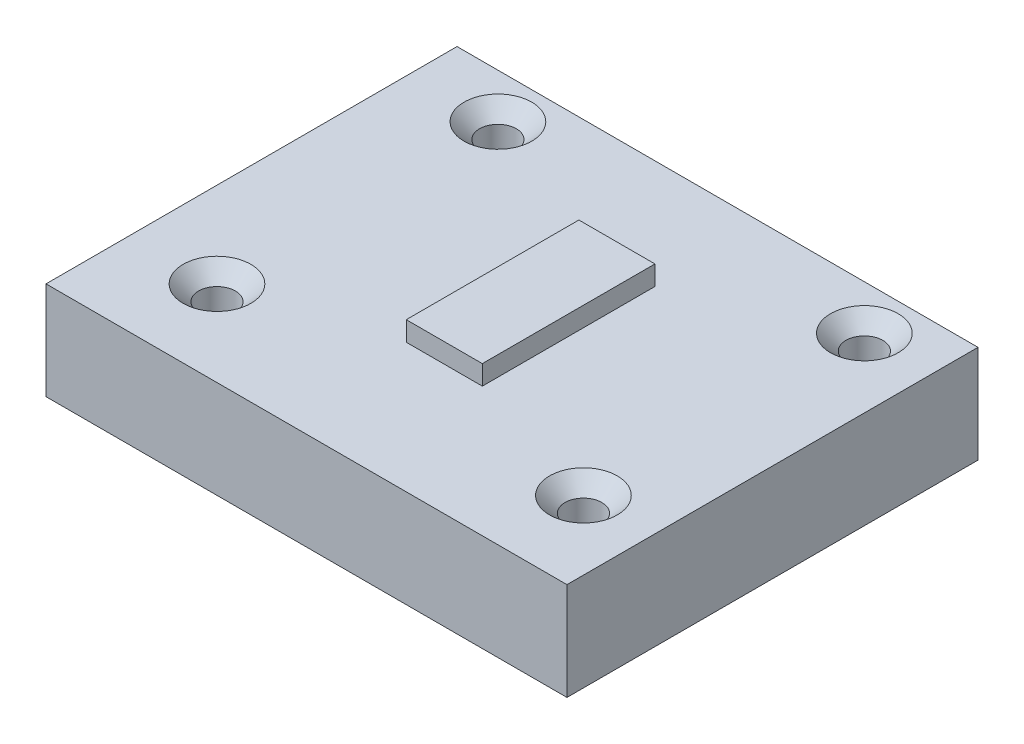
ISO-10303-21;
HEADER;
FILE_DESCRIPTION(('STEP AP214'),'2;1');
FILE_NAME('part.step','',(''),(''),'','','');
FILE_SCHEMA(('AUTOMOTIVE_DESIGN { 1 0 10303 214 1 1 1 1 }'));
ENDSEC;
DATA;
#1=APPLICATION_CONTEXT('core data for automotive mechanical design processes');
#2=APPLICATION_PROTOCOL_DEFINITION('international standard','automotive_design',2000,#1);
#3=PRODUCT_CONTEXT('',#1,'mechanical');
#4=PRODUCT('Part','Part','',(#3));
#5=PRODUCT_RELATED_PRODUCT_CATEGORY('part','',(#4));
#6=PRODUCT_DEFINITION_FORMATION('','',#4);
#7=PRODUCT_DEFINITION_CONTEXT('part definition',#1,'design');
#8=PRODUCT_DEFINITION('design','',#6,#7);
#9=PRODUCT_DEFINITION_SHAPE('','',#8);
#10=(LENGTH_UNIT() NAMED_UNIT(*) SI_UNIT(.MILLI.,.METRE.));
#11=(NAMED_UNIT(*) PLANE_ANGLE_UNIT() SI_UNIT($,.RADIAN.));
#12=(NAMED_UNIT(*) SI_UNIT($,.STERADIAN.) SOLID_ANGLE_UNIT());
#13=UNCERTAINTY_MEASURE_WITH_UNIT(LENGTH_MEASURE(1.E-05),#10,'distance_accuracy_value','');
#14=(GEOMETRIC_REPRESENTATION_CONTEXT(3) GLOBAL_UNCERTAINTY_ASSIGNED_CONTEXT((#13)) GLOBAL_UNIT_ASSIGNED_CONTEXT((#10,
#11,#12)) REPRESENTATION_CONTEXT('',''));
#15=CARTESIAN_POINT('',(0.,0.,0.));
#16=DIRECTION('',(0.,0.,1.));
#17=DIRECTION('',(1.,0.,0.));
#18=AXIS2_PLACEMENT_3D('',#15,#16,#17);
#19=CARTESIAN_POINT('',(0.,6.35,0.));
#20=DIRECTION('',(1.,0.,0.));
#21=DIRECTION('',(0.,0.,-1.));
#22=AXIS2_PLACEMENT_3D('',#19,#20,#21);
#23=PLANE('',#22);
#24=DIRECTION('',(0.,1.,0.));
#25=VECTOR('',#24,1.);
#26=CARTESIAN_POINT('',(0.,0.,-26.7116238034699));
#27=LINE('',#26,#25);
#28=CARTESIAN_POINT('',(0.,0.,-26.7116238034699));
#29=VERTEX_POINT('',#28);
#30=CARTESIAN_POINT('',(0.,6.35,-26.7116238034699));
#31=VERTEX_POINT('',#30);
#32=EDGE_CURVE('E113',#29,#31,#27,.T.);
#33=ORIENTED_EDGE('',*,*,#32,.F.);
#34=DIRECTION('',(0.,0.,1.));
#35=VECTOR('',#34,1.);
#36=CARTESIAN_POINT('',(0.,0.,0.));
#37=LINE('',#36,#35);
#38=CARTESIAN_POINT('',(0.,0.,0.));
#39=VERTEX_POINT('',#38);
#40=EDGE_CURVE('E126',#29,#39,#37,.T.);
#41=ORIENTED_EDGE('',*,*,#40,.T.);
#42=DIRECTION('',(0.,-1.,0.));
#43=VECTOR('',#42,1.);
#44=CARTESIAN_POINT('',(0.,6.35,0.));
#45=LINE('',#44,#43);
#46=CARTESIAN_POINT('',(0.,6.35,0.));
#47=VERTEX_POINT('',#46);
#48=EDGE_CURVE('E11',#47,#39,#45,.T.);
#49=ORIENTED_EDGE('',*,*,#48,.F.);
#50=DIRECTION('',(0.,0.,1.));
#51=VECTOR('',#50,1.);
#52=CARTESIAN_POINT('',(0.,6.35,0.));
#53=LINE('',#52,#51);
#54=EDGE_CURVE('E128',#31,#47,#53,.T.);
#55=ORIENTED_EDGE('',*,*,#54,.F.);
#56=EDGE_LOOP('',(#33,#41,#49,#55));
#57=FACE_BOUND('',#56,.T.);
#58=ADVANCED_FACE('F45',(#57),#23,.F.);
#59=CARTESIAN_POINT('',(0.,6.35,0.));
#60=DIRECTION('',(0.,-1.,0.));
#61=DIRECTION('',(0.,0.,-1.));
#62=AXIS2_PLACEMENT_3D('',#59,#60,#61);
#63=PLANE('',#62);
#64=DIRECTION('',(1.,0.,0.));
#65=VECTOR('',#64,1.);
#66=CARTESIAN_POINT('',(0.,6.35,0.));
#67=LINE('',#66,#65);
#68=CARTESIAN_POINT('',(33.855228979774,6.35,0.));
#69=VERTEX_POINT('',#68);
#70=EDGE_CURVE('E53',#47,#69,#67,.T.);
#71=ORIENTED_EDGE('',*,*,#70,.T.);
#72=DIRECTION('',(0.,0.,1.));
#73=VECTOR('',#72,1.);
#74=CARTESIAN_POINT('',(33.855228979774,6.35,0.));
#75=LINE('',#74,#73);
#76=CARTESIAN_POINT('',(33.855228979774,6.35,-26.7116238034699));
#77=VERTEX_POINT('',#76);
#78=EDGE_CURVE('E60',#77,#69,#75,.T.);
#79=ORIENTED_EDGE('',*,*,#78,.F.);
#80=DIRECTION('',(-1.,0.,0.));
#81=VECTOR('',#80,1.);
#82=CARTESIAN_POINT('',(0.,6.35,-26.7116238034699));
#83=LINE('',#82,#81);
#84=EDGE_CURVE('E241',#77,#31,#83,.T.);
#85=ORIENTED_EDGE('',*,*,#84,.T.);
#86=ORIENTED_EDGE('',*,*,#54,.T.);
#87=EDGE_LOOP('',(#71,#79,#85,#86));
#88=FACE_BOUND('',#87,.T.);
#89=CARTESIAN_POINT('',(29.36875,6.35,-23.8125));
#90=DIRECTION('',(0.,1.,0.));
#91=DIRECTION('',(0.,0.,1.));
#92=AXIS2_PLACEMENT_3D('',#89,#90,#91);
#93=CIRCLE('',#92,2.2);
#94=CARTESIAN_POINT('',(29.36875,6.35,-21.6125));
#95=VERTEX_POINT('',#94);
#96=EDGE_CURVE('E152',#95,#95,#93,.T.);
#97=ORIENTED_EDGE('',*,*,#96,.F.);
#98=EDGE_LOOP('',(#97));
#99=FACE_BOUND('',#98,.T.);
#100=CARTESIAN_POINT('',(5.55625,6.35,-23.8125));
#101=DIRECTION('',(0.,1.,0.));
#102=DIRECTION('',(0.,0.,1.));
#103=AXIS2_PLACEMENT_3D('',#100,#101,#102);
#104=CIRCLE('',#103,2.2);
#105=CARTESIAN_POINT('',(5.55625,6.35,-21.6125));
#106=VERTEX_POINT('',#105);
#107=EDGE_CURVE('E164',#106,#106,#104,.T.);
#108=ORIENTED_EDGE('',*,*,#107,.F.);
#109=EDGE_LOOP('',(#108));
#110=FACE_BOUND('',#109,.T.);
#111=CARTESIAN_POINT('',(29.36875,6.35,-5.55625));
#112=DIRECTION('',(0.,1.,0.));
#113=DIRECTION('',(0.,0.,1.));
#114=AXIS2_PLACEMENT_3D('',#111,#112,#113);
#115=CIRCLE('',#114,2.2);
#116=CARTESIAN_POINT('',(29.36875,6.35,-3.35625));
#117=VERTEX_POINT('',#116);
#118=EDGE_CURVE('E176',#117,#117,#115,.T.);
#119=ORIENTED_EDGE('',*,*,#118,.F.);
#120=EDGE_LOOP('',(#119));
#121=FACE_BOUND('',#120,.T.);
#122=CARTESIAN_POINT('',(5.55625,6.35,-5.55625));
#123=DIRECTION('',(0.,1.,0.));
#124=DIRECTION('',(0.,0.,1.));
#125=AXIS2_PLACEMENT_3D('',#122,#123,#124);
#126=CIRCLE('',#125,2.2);
#127=CARTESIAN_POINT('',(5.55625,6.35,-3.35625));
#128=VERTEX_POINT('',#127);
#129=EDGE_CURVE('E188',#128,#128,#126,.T.);
#130=ORIENTED_EDGE('',*,*,#129,.F.);
#131=EDGE_LOOP('',(#130));
#132=FACE_BOUND('',#131,.T.);
#133=DIRECTION('',(0.,0.,1.));
#134=VECTOR('',#133,1.);
#135=CARTESIAN_POINT('',(14.9914350712743,6.35,-19.6382153627277));
#136=LINE('',#135,#134);
#137=CARTESIAN_POINT('',(14.9914350712743,6.35,-19.6382153627277));
#138=VERTEX_POINT('',#137);
#139=CARTESIAN_POINT('',(14.9914350712743,6.35,-8.41998192519793));
#140=VERTEX_POINT('',#139);
#141=EDGE_CURVE('E219',#138,#140,#136,.T.);
#142=ORIENTED_EDGE('',*,*,#141,.F.);
#143=DIRECTION('',(-1.,0.,0.));
#144=VECTOR('',#143,1.);
#145=CARTESIAN_POINT('',(14.9914350712743,6.35,-19.6382153627277));
#146=LINE('',#145,#144);
#147=CARTESIAN_POINT('',(19.935063365779,6.35,-19.6382153627277));
#148=VERTEX_POINT('',#147);
#149=EDGE_CURVE('E208',#148,#138,#146,.T.);
#150=ORIENTED_EDGE('',*,*,#149,.F.);
#151=DIRECTION('',(0.,0.,-1.));
#152=VECTOR('',#151,1.);
#153=CARTESIAN_POINT('',(19.935063365779,6.35,-19.6382153627277));
#154=LINE('',#153,#152);
#155=CARTESIAN_POINT('',(19.935063365779,6.35,-8.41998192519793));
#156=VERTEX_POINT('',#155);
#157=EDGE_CURVE('E213',#156,#148,#154,.T.);
#158=ORIENTED_EDGE('',*,*,#157,.F.);
#159=DIRECTION('',(1.,0.,0.));
#160=VECTOR('',#159,1.);
#161=CARTESIAN_POINT('',(14.9914350712743,6.35,-8.41998192519793));
#162=LINE('',#161,#160);
#163=EDGE_CURVE('E68',#140,#156,#162,.T.);
#164=ORIENTED_EDGE('',*,*,#163,.F.);
#165=EDGE_LOOP('',(#142,#150,#158,#164));
#166=FACE_BOUND('',#165,.T.);
#167=ADVANCED_FACE('F249',(#88,#99,#110,#121,#132,#166),#63,.F.);
#168=CARTESIAN_POINT('',(0.,0.,0.));
#169=DIRECTION('',(0.,-1.,0.));
#170=DIRECTION('',(0.,0.,-1.));
#171=AXIS2_PLACEMENT_3D('',#168,#169,#170);
#172=PLANE('',#171);
#173=DIRECTION('',(0.,0.,1.));
#174=VECTOR('',#173,1.);
#175=CARTESIAN_POINT('',(33.855228979774,0.,0.));
#176=LINE('',#175,#174);
#177=CARTESIAN_POINT('',(33.855228979774,0.,-26.7116238034699));
#178=VERTEX_POINT('',#177);
#179=CARTESIAN_POINT('',(33.855228979774,0.,0.));
#180=VERTEX_POINT('',#179);
#181=EDGE_CURVE('E121',#178,#180,#176,.T.);
#182=ORIENTED_EDGE('',*,*,#181,.T.);
#183=DIRECTION('',(1.,0.,0.));
#184=VECTOR('',#183,1.);
#185=CARTESIAN_POINT('',(0.,0.,0.));
#186=LINE('',#185,#184);
#187=EDGE_CURVE('E134',#39,#180,#186,.T.);
#188=ORIENTED_EDGE('',*,*,#187,.F.);
#189=ORIENTED_EDGE('',*,*,#40,.F.);
#190=DIRECTION('',(-1.,0.,0.));
#191=VECTOR('',#190,1.);
#192=CARTESIAN_POINT('',(0.,0.,-26.7116238034699));
#193=LINE('',#192,#191);
#194=EDGE_CURVE('E109',#178,#29,#193,.T.);
#195=ORIENTED_EDGE('',*,*,#194,.F.);
#196=EDGE_LOOP('',(#182,#188,#189,#195));
#197=FACE_BOUND('',#196,.T.);
#198=CARTESIAN_POINT('',(29.36875,0.,-23.8125));
#199=DIRECTION('',(0.,1.,0.));
#200=DIRECTION('',(0.,0.,1.));
#201=AXIS2_PLACEMENT_3D('',#198,#199,#200);
#202=CIRCLE('',#201,1.2);
#203=CARTESIAN_POINT('',(29.36875,0.,-22.6125));
#204=VERTEX_POINT('',#203);
#205=EDGE_CURVE('E136',#204,#204,#202,.T.);
#206=ORIENTED_EDGE('',*,*,#205,.T.);
#207=EDGE_LOOP('',(#206));
#208=FACE_BOUND('',#207,.T.);
#209=CARTESIAN_POINT('',(5.55625,0.,-23.8125));
#210=DIRECTION('',(0.,1.,0.));
#211=DIRECTION('',(0.,0.,1.));
#212=AXIS2_PLACEMENT_3D('',#209,#210,#211);
#213=CIRCLE('',#212,1.2);
#214=CARTESIAN_POINT('',(5.55625,0.,-22.6125));
#215=VERTEX_POINT('',#214);
#216=EDGE_CURVE('E156',#215,#215,#213,.T.);
#217=ORIENTED_EDGE('',*,*,#216,.T.);
#218=EDGE_LOOP('',(#217));
#219=FACE_BOUND('',#218,.T.);
#220=CARTESIAN_POINT('',(29.36875,0.,-5.55625));
#221=DIRECTION('',(0.,1.,0.));
#222=DIRECTION('',(0.,0.,1.));
#223=AXIS2_PLACEMENT_3D('',#220,#221,#222);
#224=CIRCLE('',#223,1.2);
#225=CARTESIAN_POINT('',(29.36875,0.,-4.35625));
#226=VERTEX_POINT('',#225);
#227=EDGE_CURVE('E168',#226,#226,#224,.T.);
#228=ORIENTED_EDGE('',*,*,#227,.T.);
#229=EDGE_LOOP('',(#228));
#230=FACE_BOUND('',#229,.T.);
#231=CARTESIAN_POINT('',(5.55625,0.,-5.55625));
#232=DIRECTION('',(0.,1.,0.));
#233=DIRECTION('',(0.,0.,1.));
#234=AXIS2_PLACEMENT_3D('',#231,#232,#233);
#235=CIRCLE('',#234,1.2);
#236=CARTESIAN_POINT('',(5.55625,0.,-4.35625));
#237=VERTEX_POINT('',#236);
#238=EDGE_CURVE('E180',#237,#237,#235,.T.);
#239=ORIENTED_EDGE('',*,*,#238,.T.);
#240=EDGE_LOOP('',(#239));
#241=FACE_BOUND('',#240,.T.);
#242=ADVANCED_FACE('F131',(#197,#208,#219,#230,#241),#172,.T.);
#243=CARTESIAN_POINT('',(0.,6.35,0.));
#244=DIRECTION('',(0.,0.,-1.));
#245=DIRECTION('',(-1.,0.,0.));
#246=AXIS2_PLACEMENT_3D('',#243,#244,#245);
#247=PLANE('',#246);
#248=ORIENTED_EDGE('',*,*,#187,.T.);
#249=DIRECTION('',(0.,1.,0.));
#250=VECTOR('',#249,1.);
#251=CARTESIAN_POINT('',(33.855228979774,0.,0.));
#252=LINE('',#251,#250);
#253=EDGE_CURVE('E223',#180,#69,#252,.T.);
#254=ORIENTED_EDGE('',*,*,#253,.T.);
#255=ORIENTED_EDGE('',*,*,#70,.F.);
#256=ORIENTED_EDGE('',*,*,#48,.T.);
#257=EDGE_LOOP('',(#248,#254,#255,#256));
#258=FACE_BOUND('',#257,.T.);
#259=ADVANCED_FACE('F246',(#258),#247,.F.);
#260=CARTESIAN_POINT('',(29.36875,6.35,-23.8125));
#261=DIRECTION('',(0.,1.,0.));
#262=DIRECTION('',(0.,0.,1.));
#263=AXIS2_PLACEMENT_3D('',#260,#261,#262);
#264=CYLINDRICAL_SURFACE('',#263,1.2);
#265=ORIENTED_EDGE('',*,*,#205,.F.);
#266=EDGE_LOOP('',(#265));
#267=FACE_BOUND('',#266,.T.);
#268=CARTESIAN_POINT('',(29.36875,5.35,-23.8125));
#269=DIRECTION('',(0.,1.,0.));
#270=DIRECTION('',(0.,0.,1.));
#271=AXIS2_PLACEMENT_3D('',#268,#269,#270);
#272=CIRCLE('',#271,1.2);
#273=CARTESIAN_POINT('',(29.36875,5.35,-22.6125));
#274=VERTEX_POINT('',#273);
#275=EDGE_CURVE('E141',#274,#274,#272,.T.);
#276=ORIENTED_EDGE('',*,*,#275,.T.);
#277=EDGE_LOOP('',(#276));
#278=FACE_BOUND('',#277,.T.);
#279=ADVANCED_FACE('F315',(#267,#278),#264,.F.);
#280=CARTESIAN_POINT('',(29.36875,6.35,-23.8125));
#281=DIRECTION('',(0.,1.,0.));
#282=DIRECTION('',(0.,0.,1.));
#283=AXIS2_PLACEMENT_3D('',#280,#281,#282);
#284=CONICAL_SURFACE('',#283,2.2,0.785398163397448);
#285=ORIENTED_EDGE('',*,*,#275,.F.);
#286=EDGE_LOOP('',(#285));
#287=FACE_BOUND('',#286,.T.);
#288=ORIENTED_EDGE('',*,*,#96,.T.);
#289=EDGE_LOOP('',(#288));
#290=FACE_BOUND('',#289,.T.);
#291=ADVANCED_FACE('F421',(#287,#290),#284,.F.);
#292=CARTESIAN_POINT('',(5.55625,6.35,-23.8125));
#293=DIRECTION('',(0.,1.,0.));
#294=DIRECTION('',(0.,0.,1.));
#295=AXIS2_PLACEMENT_3D('',#292,#293,#294);
#296=CYLINDRICAL_SURFACE('',#295,1.2);
#297=ORIENTED_EDGE('',*,*,#216,.F.);
#298=EDGE_LOOP('',(#297));
#299=FACE_BOUND('',#298,.T.);
#300=CARTESIAN_POINT('',(5.55625,5.35,-23.8125));
#301=DIRECTION('',(0.,1.,0.));
#302=DIRECTION('',(0.,0.,1.));
#303=AXIS2_PLACEMENT_3D('',#300,#301,#302);
#304=CIRCLE('',#303,1.2);
#305=CARTESIAN_POINT('',(5.55625,5.35,-22.6125));
#306=VERTEX_POINT('',#305);
#307=EDGE_CURVE('E160',#306,#306,#304,.T.);
#308=ORIENTED_EDGE('',*,*,#307,.T.);
#309=EDGE_LOOP('',(#308));
#310=FACE_BOUND('',#309,.T.);
#311=ADVANCED_FACE('F411',(#299,#310),#296,.F.);
#312=CARTESIAN_POINT('',(5.55625,6.35,-23.8125));
#313=DIRECTION('',(0.,1.,0.));
#314=DIRECTION('',(0.,0.,1.));
#315=AXIS2_PLACEMENT_3D('',#312,#313,#314);
#316=CONICAL_SURFACE('',#315,2.2,0.785398163397449);
#317=ORIENTED_EDGE('',*,*,#307,.F.);
#318=EDGE_LOOP('',(#317));
#319=FACE_BOUND('',#318,.T.);
#320=ORIENTED_EDGE('',*,*,#107,.T.);
#321=EDGE_LOOP('',(#320));
#322=FACE_BOUND('',#321,.T.);
#323=ADVANCED_FACE('F401',(#319,#322),#316,.F.);
#324=CARTESIAN_POINT('',(29.36875,6.35,-5.55625));
#325=DIRECTION('',(0.,1.,0.));
#326=DIRECTION('',(0.,0.,1.));
#327=AXIS2_PLACEMENT_3D('',#324,#325,#326);
#328=CYLINDRICAL_SURFACE('',#327,1.2);
#329=ORIENTED_EDGE('',*,*,#227,.F.);
#330=EDGE_LOOP('',(#329));
#331=FACE_BOUND('',#330,.T.);
#332=CARTESIAN_POINT('',(29.36875,5.35,-5.55625));
#333=DIRECTION('',(0.,1.,0.));
#334=DIRECTION('',(0.,0.,1.));
#335=AXIS2_PLACEMENT_3D('',#332,#333,#334);
#336=CIRCLE('',#335,1.2);
#337=CARTESIAN_POINT('',(29.36875,5.35,-4.35625));
#338=VERTEX_POINT('',#337);
#339=EDGE_CURVE('E172',#338,#338,#336,.T.);
#340=ORIENTED_EDGE('',*,*,#339,.T.);
#341=EDGE_LOOP('',(#340));
#342=FACE_BOUND('',#341,.T.);
#343=ADVANCED_FACE('F391',(#331,#342),#328,.F.);
#344=CARTESIAN_POINT('',(29.36875,6.35,-5.55625));
#345=DIRECTION('',(0.,1.,0.));
#346=DIRECTION('',(0.,0.,1.));
#347=AXIS2_PLACEMENT_3D('',#344,#345,#346);
#348=CONICAL_SURFACE('',#347,2.2,0.785398163397448);
#349=ORIENTED_EDGE('',*,*,#339,.F.);
#350=EDGE_LOOP('',(#349));
#351=FACE_BOUND('',#350,.T.);
#352=ORIENTED_EDGE('',*,*,#118,.T.);
#353=EDGE_LOOP('',(#352));
#354=FACE_BOUND('',#353,.T.);
#355=ADVANCED_FACE('F381',(#351,#354),#348,.F.);
#356=CARTESIAN_POINT('',(5.55625,6.35,-5.55625));
#357=DIRECTION('',(0.,1.,0.));
#358=DIRECTION('',(0.,0.,1.));
#359=AXIS2_PLACEMENT_3D('',#356,#357,#358);
#360=CYLINDRICAL_SURFACE('',#359,1.2);
#361=ORIENTED_EDGE('',*,*,#238,.F.);
#362=EDGE_LOOP('',(#361));
#363=FACE_BOUND('',#362,.T.);
#364=CARTESIAN_POINT('',(5.55625,5.35,-5.55625));
#365=DIRECTION('',(0.,1.,0.));
#366=DIRECTION('',(0.,0.,1.));
#367=AXIS2_PLACEMENT_3D('',#364,#365,#366);
#368=CIRCLE('',#367,1.2);
#369=CARTESIAN_POINT('',(5.55625,5.35,-4.35625));
#370=VERTEX_POINT('',#369);
#371=EDGE_CURVE('E184',#370,#370,#368,.T.);
#372=ORIENTED_EDGE('',*,*,#371,.T.);
#373=EDGE_LOOP('',(#372));
#374=FACE_BOUND('',#373,.T.);
#375=ADVANCED_FACE('F371',(#363,#374),#360,.F.);
#376=CARTESIAN_POINT('',(5.55625,6.35,-5.55625));
#377=DIRECTION('',(0.,1.,0.));
#378=DIRECTION('',(0.,0.,1.));
#379=AXIS2_PLACEMENT_3D('',#376,#377,#378);
#380=CONICAL_SURFACE('',#379,2.2,0.785398163397449);
#381=ORIENTED_EDGE('',*,*,#371,.F.);
#382=EDGE_LOOP('',(#381));
#383=FACE_BOUND('',#382,.T.);
#384=ORIENTED_EDGE('',*,*,#129,.T.);
#385=EDGE_LOOP('',(#384));
#386=FACE_BOUND('',#385,.T.);
#387=ADVANCED_FACE('F284',(#383,#386),#380,.F.);
#388=CARTESIAN_POINT('',(14.9914350712743,7.62,-19.6382153627277));
#389=DIRECTION('',(1.,0.,0.));
#390=DIRECTION('',(0.,0.,-1.));
#391=AXIS2_PLACEMENT_3D('',#388,#389,#390);
#392=PLANE('',#391);
#393=ORIENTED_EDGE('',*,*,#141,.T.);
#394=DIRECTION('',(0.,-1.,0.));
#395=VECTOR('',#394,1.);
#396=CARTESIAN_POINT('',(14.9914350712743,7.62,-8.41998192519793));
#397=LINE('',#396,#395);
#398=CARTESIAN_POINT('',(14.9914350712743,7.62,-8.41998192519793));
#399=VERTEX_POINT('',#398);
#400=EDGE_CURVE('E192',#399,#140,#397,.T.);
#401=ORIENTED_EDGE('',*,*,#400,.F.);
#402=DIRECTION('',(0.,0.,1.));
#403=VECTOR('',#402,1.);
#404=CARTESIAN_POINT('',(14.9914350712743,7.62,-19.6382153627277));
#405=LINE('',#404,#403);
#406=CARTESIAN_POINT('',(14.9914350712743,7.62,-19.6382153627277));
#407=VERTEX_POINT('',#406);
#408=EDGE_CURVE('E212',#407,#399,#405,.T.);
#409=ORIENTED_EDGE('',*,*,#408,.F.);
#410=DIRECTION('',(0.,-1.,0.));
#411=VECTOR('',#410,1.);
#412=CARTESIAN_POINT('',(14.9914350712743,7.62,-19.6382153627277));
#413=LINE('',#412,#411);
#414=EDGE_CURVE('E203',#407,#138,#413,.T.);
#415=ORIENTED_EDGE('',*,*,#414,.T.);
#416=EDGE_LOOP('',(#393,#401,#409,#415));
#417=FACE_BOUND('',#416,.T.);
#418=ADVANCED_FACE('F268',(#417),#392,.F.);
#419=CARTESIAN_POINT('',(14.9914350712743,7.62,-8.41998192519793));
#420=DIRECTION('',(0.,0.,-1.));
#421=DIRECTION('',(-1.,0.,0.));
#422=AXIS2_PLACEMENT_3D('',#419,#420,#421);
#423=PLANE('',#422);
#424=ORIENTED_EDGE('',*,*,#163,.T.);
#425=DIRECTION('',(0.,-1.,0.));
#426=VECTOR('',#425,1.);
#427=CARTESIAN_POINT('',(19.935063365779,7.62,-8.41998192519793));
#428=LINE('',#427,#426);
#429=CARTESIAN_POINT('',(19.935063365779,7.62,-8.41998192519793));
#430=VERTEX_POINT('',#429);
#431=EDGE_CURVE('E195',#430,#156,#428,.T.);
#432=ORIENTED_EDGE('',*,*,#431,.F.);
#433=DIRECTION('',(1.,0.,0.));
#434=VECTOR('',#433,1.);
#435=CARTESIAN_POINT('',(14.9914350712743,7.62,-8.41998192519793));
#436=LINE('',#435,#434);
#437=EDGE_CURVE('E229',#399,#430,#436,.T.);
#438=ORIENTED_EDGE('',*,*,#437,.F.);
#439=ORIENTED_EDGE('',*,*,#400,.T.);
#440=EDGE_LOOP('',(#424,#432,#438,#439));
#441=FACE_BOUND('',#440,.T.);
#442=ADVANCED_FACE('F276',(#441),#423,.F.);
#443=CARTESIAN_POINT('',(19.935063365779,7.62,-19.6382153627277));
#444=DIRECTION('',(-1.,0.,0.));
#445=DIRECTION('',(0.,0.,1.));
#446=AXIS2_PLACEMENT_3D('',#443,#444,#445);
#447=PLANE('',#446);
#448=ORIENTED_EDGE('',*,*,#157,.T.);
#449=DIRECTION('',(0.,-1.,0.));
#450=VECTOR('',#449,1.);
#451=CARTESIAN_POINT('',(19.935063365779,7.62,-19.6382153627277));
#452=LINE('',#451,#450);
#453=CARTESIAN_POINT('',(19.935063365779,7.62,-19.6382153627277));
#454=VERTEX_POINT('',#453);
#455=EDGE_CURVE('E199',#454,#148,#452,.T.);
#456=ORIENTED_EDGE('',*,*,#455,.F.);
#457=DIRECTION('',(0.,0.,-1.));
#458=VECTOR('',#457,1.);
#459=CARTESIAN_POINT('',(19.935063365779,7.62,-19.6382153627277));
#460=LINE('',#459,#458);
#461=EDGE_CURVE('E226',#430,#454,#460,.T.);
#462=ORIENTED_EDGE('',*,*,#461,.F.);
#463=ORIENTED_EDGE('',*,*,#431,.T.);
#464=EDGE_LOOP('',(#448,#456,#462,#463));
#465=FACE_BOUND('',#464,.T.);
#466=ADVANCED_FACE('F274',(#465),#447,.F.);
#467=CARTESIAN_POINT('',(14.9914350712743,7.62,-19.6382153627277));
#468=DIRECTION('',(0.,0.,1.));
#469=DIRECTION('',(1.,0.,0.));
#470=AXIS2_PLACEMENT_3D('',#467,#468,#469);
#471=PLANE('',#470);
#472=ORIENTED_EDGE('',*,*,#149,.T.);
#473=ORIENTED_EDGE('',*,*,#414,.F.);
#474=DIRECTION('',(-1.,0.,0.));
#475=VECTOR('',#474,1.);
#476=CARTESIAN_POINT('',(14.9914350712743,7.62,-19.6382153627277));
#477=LINE('',#476,#475);
#478=EDGE_CURVE('E207',#454,#407,#477,.T.);
#479=ORIENTED_EDGE('',*,*,#478,.F.);
#480=ORIENTED_EDGE('',*,*,#455,.T.);
#481=EDGE_LOOP('',(#472,#473,#479,#480));
#482=FACE_BOUND('',#481,.T.);
#483=ADVANCED_FACE('F264',(#482),#471,.F.);
#484=CARTESIAN_POINT('',(0.,7.62,0.));
#485=DIRECTION('',(0.,1.,0.));
#486=DIRECTION('',(0.,0.,1.));
#487=AXIS2_PLACEMENT_3D('',#484,#485,#486);
#488=PLANE('',#487);
#489=ORIENTED_EDGE('',*,*,#408,.T.);
#490=ORIENTED_EDGE('',*,*,#437,.T.);
#491=ORIENTED_EDGE('',*,*,#461,.T.);
#492=ORIENTED_EDGE('',*,*,#478,.T.);
#493=EDGE_LOOP('',(#489,#490,#491,#492));
#494=FACE_BOUND('',#493,.T.);
#495=ADVANCED_FACE('F270',(#494),#488,.T.);
#496=CARTESIAN_POINT('',(33.855228979774,0.,0.));
#497=DIRECTION('',(-1.,0.,0.));
#498=DIRECTION('',(0.,0.,1.));
#499=AXIS2_PLACEMENT_3D('',#496,#497,#498);
#500=PLANE('',#499);
#501=ORIENTED_EDGE('',*,*,#78,.T.);
#502=ORIENTED_EDGE('',*,*,#253,.F.);
#503=ORIENTED_EDGE('',*,*,#181,.F.);
#504=DIRECTION('',(0.,1.,0.));
#505=VECTOR('',#504,1.);
#506=CARTESIAN_POINT('',(33.855228979774,0.,-26.7116238034699));
#507=LINE('',#506,#505);
#508=EDGE_CURVE('E115',#178,#77,#507,.T.);
#509=ORIENTED_EDGE('',*,*,#508,.T.);
#510=EDGE_LOOP('',(#501,#502,#503,#509));
#511=FACE_BOUND('',#510,.T.);
#512=ADVANCED_FACE('F318',(#511),#500,.F.);
#513=CARTESIAN_POINT('',(0.,0.,-26.7116238034699));
#514=DIRECTION('',(0.,0.,-1.));
#515=DIRECTION('',(-1.,0.,0.));
#516=AXIS2_PLACEMENT_3D('',#513,#514,#515);
#517=PLANE('',#516);
#518=ORIENTED_EDGE('',*,*,#84,.F.);
#519=ORIENTED_EDGE('',*,*,#508,.F.);
#520=ORIENTED_EDGE('',*,*,#194,.T.);
#521=ORIENTED_EDGE('',*,*,#32,.T.);
#522=EDGE_LOOP('',(#518,#519,#520,#521));
#523=FACE_BOUND('',#522,.T.);
#524=ADVANCED_FACE('F112',(#523),#517,.T.);
#525=CLOSED_SHELL('',(#58,#167,#242,#259,#279,#291,#311,#323,#343,#355,#375,#387,#418,#442,#466,
#483,#495,#512,#524));
#526=MANIFOLD_SOLID_BREP('B2',#525);
#527=ADVANCED_BREP_SHAPE_REPRESENTATION('',(#18,#526),#14);
#528=SHAPE_DEFINITION_REPRESENTATION(#9,#527);
ENDSEC;
END-ISO-10303-21;
